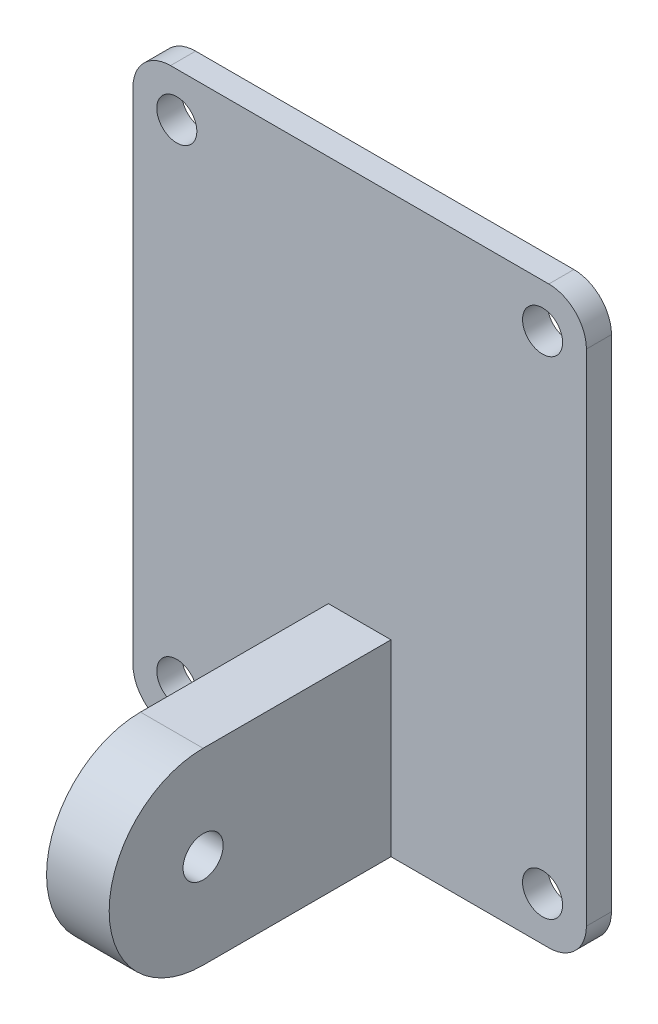
ISO-10303-21;
HEADER;
FILE_DESCRIPTION(('STEP AP214'),'2;1');
FILE_NAME('part.step','',(''),(''),'','','');
FILE_SCHEMA(('AUTOMOTIVE_DESIGN { 1 0 10303 214 1 1 1 1 }'));
ENDSEC;
DATA;
#1=APPLICATION_CONTEXT('core data for automotive mechanical design processes');
#2=APPLICATION_PROTOCOL_DEFINITION('international standard','automotive_design',2000,#1);
#3=PRODUCT_CONTEXT('',#1,'mechanical');
#4=PRODUCT('Part','Part','',(#3));
#5=PRODUCT_RELATED_PRODUCT_CATEGORY('part','',(#4));
#6=PRODUCT_DEFINITION_FORMATION('','',#4);
#7=PRODUCT_DEFINITION_CONTEXT('part definition',#1,'design');
#8=PRODUCT_DEFINITION('design','',#6,#7);
#9=PRODUCT_DEFINITION_SHAPE('','',#8);
#10=(LENGTH_UNIT() NAMED_UNIT(*) SI_UNIT(.MILLI.,.METRE.));
#11=(NAMED_UNIT(*) PLANE_ANGLE_UNIT() SI_UNIT($,.RADIAN.));
#12=(NAMED_UNIT(*) SI_UNIT($,.STERADIAN.) SOLID_ANGLE_UNIT());
#13=UNCERTAINTY_MEASURE_WITH_UNIT(LENGTH_MEASURE(1.E-05),#10,'distance_accuracy_value','');
#14=(GEOMETRIC_REPRESENTATION_CONTEXT(3) GLOBAL_UNCERTAINTY_ASSIGNED_CONTEXT((#13)) GLOBAL_UNIT_ASSIGNED_CONTEXT((#10,
#11,#12)) REPRESENTATION_CONTEXT('',''));
#15=CARTESIAN_POINT('',(0.,0.,0.));
#16=DIRECTION('',(0.,0.,1.));
#17=DIRECTION('',(1.,0.,0.));
#18=AXIS2_PLACEMENT_3D('',#15,#16,#17);
#19=CARTESIAN_POINT('',(312.882416229794,321.041107056174,2.));
#20=DIRECTION('',(0.,0.,1.));
#21=DIRECTION('',(1.,0.,0.));
#22=AXIS2_PLACEMENT_3D('',#19,#20,#21);
#23=PLANE('',#22);
#24=DIRECTION('',(0.,1.,0.));
#25=VECTOR('',#24,1.);
#26=CARTESIAN_POINT('',(330.482416229794,278.141107056174,2.));
#27=LINE('',#26,#25);
#28=CARTESIAN_POINT('',(330.482416229794,278.141107056174,2.));
#29=VERTEX_POINT('',#28);
#30=CARTESIAN_POINT('',(330.482416229794,293.141107056174,2.));
#31=VERTEX_POINT('',#30);
#32=EDGE_CURVE('E156',#29,#31,#27,.T.);
#33=ORIENTED_EDGE('',*,*,#32,.F.);
#34=DIRECTION('',(1.,0.,0.));
#35=VECTOR('',#34,1.);
#36=CARTESIAN_POINT('',(312.882416229794,278.141107056174,2.));
#37=LINE('',#36,#35);
#38=CARTESIAN_POINT('',(343.082416229794,278.141107056174,2.));
#39=VERTEX_POINT('',#38);
#40=EDGE_CURVE('E198',#29,#39,#37,.T.);
#41=ORIENTED_EDGE('',*,*,#40,.T.);
#42=CARTESIAN_POINT('',(343.082416229794,281.141107056174,2.));
#43=DIRECTION('',(0.,0.,1.));
#44=DIRECTION('',(1.,0.,0.));
#45=AXIS2_PLACEMENT_3D('',#42,#43,#44);
#46=CIRCLE('',#45,3.);
#47=CARTESIAN_POINT('',(346.082416229794,281.141107056174,2.));
#48=VERTEX_POINT('',#47);
#49=EDGE_CURVE('E201',#39,#48,#46,.T.);
#50=ORIENTED_EDGE('',*,*,#49,.T.);
#51=DIRECTION('',(0.,1.,0.));
#52=VECTOR('',#51,1.);
#53=CARTESIAN_POINT('',(346.082416229794,321.041107056174,2.));
#54=LINE('',#53,#52);
#55=CARTESIAN_POINT('',(346.082416229794,321.041107056174,2.));
#56=VERTEX_POINT('',#55);
#57=EDGE_CURVE('E203',#48,#56,#54,.T.);
#58=ORIENTED_EDGE('',*,*,#57,.T.);
#59=CARTESIAN_POINT('',(343.082416229794,321.041107056174,2.));
#60=DIRECTION('',(0.,0.,1.));
#61=DIRECTION('',(1.,0.,0.));
#62=AXIS2_PLACEMENT_3D('',#59,#60,#61);
#63=CIRCLE('',#62,3.);
#64=CARTESIAN_POINT('',(343.082416229794,324.041107056174,2.));
#65=VERTEX_POINT('',#64);
#66=EDGE_CURVE('E205',#56,#65,#63,.T.);
#67=ORIENTED_EDGE('',*,*,#66,.T.);
#68=DIRECTION('',(-1.,0.,0.));
#69=VECTOR('',#68,1.);
#70=CARTESIAN_POINT('',(312.882416229794,324.041107056174,2.));
#71=LINE('',#70,#69);
#72=CARTESIAN_POINT('',(312.882416229794,324.041107056174,2.));
#73=VERTEX_POINT('',#72);
#74=EDGE_CURVE('E207',#65,#73,#71,.T.);
#75=ORIENTED_EDGE('',*,*,#74,.T.);
#76=CARTESIAN_POINT('',(312.882416229794,321.041107056174,2.));
#77=DIRECTION('',(0.,0.,1.));
#78=DIRECTION('',(1.,0.,0.));
#79=AXIS2_PLACEMENT_3D('',#76,#77,#78);
#80=CIRCLE('',#79,3.);
#81=CARTESIAN_POINT('',(309.882416229794,321.041107056174,2.));
#82=VERTEX_POINT('',#81);
#83=EDGE_CURVE('E190',#73,#82,#80,.T.);
#84=ORIENTED_EDGE('',*,*,#83,.T.);
#85=DIRECTION('',(0.,-1.,0.));
#86=VECTOR('',#85,1.);
#87=CARTESIAN_POINT('',(309.882416229794,321.041107056174,2.));
#88=LINE('',#87,#86);
#89=CARTESIAN_POINT('',(309.882416229794,281.141107056174,2.));
#90=VERTEX_POINT('',#89);
#91=EDGE_CURVE('E193',#82,#90,#88,.T.);
#92=ORIENTED_EDGE('',*,*,#91,.T.);
#93=CARTESIAN_POINT('',(312.882416229794,281.141107056174,2.));
#94=DIRECTION('',(0.,0.,1.));
#95=DIRECTION('',(1.,0.,0.));
#96=AXIS2_PLACEMENT_3D('',#93,#94,#95);
#97=CIRCLE('',#96,3.);
#98=CARTESIAN_POINT('',(312.882416229794,278.141107056174,2.));
#99=VERTEX_POINT('',#98);
#100=EDGE_CURVE('E196',#90,#99,#97,.T.);
#101=ORIENTED_EDGE('',*,*,#100,.T.);
#102=CARTESIAN_POINT('',(325.482416229794,278.141107056174,2.));
#103=VERTEX_POINT('',#102);
#104=EDGE_CURVE('E199',#99,#103,#37,.T.);
#105=ORIENTED_EDGE('',*,*,#104,.T.);
#106=DIRECTION('',(0.,-1.,0.));
#107=VECTOR('',#106,1.);
#108=CARTESIAN_POINT('',(325.482416229794,293.141107056174,2.));
#109=LINE('',#108,#107);
#110=CARTESIAN_POINT('',(325.482416229794,293.141107056174,2.));
#111=VERTEX_POINT('',#110);
#112=EDGE_CURVE('E55',#111,#103,#109,.T.);
#113=ORIENTED_EDGE('',*,*,#112,.F.);
#114=DIRECTION('',(-1.,0.,0.));
#115=VECTOR('',#114,1.);
#116=CARTESIAN_POINT('',(330.482416229794,293.141107056174,2.));
#117=LINE('',#116,#115);
#118=EDGE_CURVE('E50',#31,#111,#117,.T.);
#119=ORIENTED_EDGE('',*,*,#118,.F.);
#120=EDGE_LOOP('',(#33,#41,#50,#58,#67,#75,#84,#92,#101,#105,#113,#119));
#121=FACE_BOUND('',#120,.T.);
#122=CARTESIAN_POINT('',(342.582416229794,320.541107056174,2.));
#123=DIRECTION('',(0.,0.,1.));
#124=DIRECTION('',(1.,0.,0.));
#125=AXIS2_PLACEMENT_3D('',#122,#123,#124);
#126=CIRCLE('',#125,1.59999999999999);
#127=CARTESIAN_POINT('',(344.182416229794,320.541107056174,2.));
#128=VERTEX_POINT('',#127);
#129=EDGE_CURVE('E172',#128,#128,#126,.T.);
#130=ORIENTED_EDGE('',*,*,#129,.F.);
#131=EDGE_LOOP('',(#130));
#132=FACE_BOUND('',#131,.T.);
#133=CARTESIAN_POINT('',(313.382416229794,320.541107056174,2.));
#134=DIRECTION('',(0.,0.,1.));
#135=DIRECTION('',(1.,0.,0.));
#136=AXIS2_PLACEMENT_3D('',#133,#134,#135);
#137=CIRCLE('',#136,1.59999999999999);
#138=CARTESIAN_POINT('',(314.982416229794,320.541107056174,2.));
#139=VERTEX_POINT('',#138);
#140=EDGE_CURVE('E184',#139,#139,#137,.T.);
#141=ORIENTED_EDGE('',*,*,#140,.F.);
#142=EDGE_LOOP('',(#141));
#143=FACE_BOUND('',#142,.T.);
#144=CARTESIAN_POINT('',(313.382416229794,281.641107056174,2.));
#145=DIRECTION('',(0.,0.,1.));
#146=DIRECTION('',(1.,0.,0.));
#147=AXIS2_PLACEMENT_3D('',#144,#145,#146);
#148=CIRCLE('',#147,1.59999999999999);
#149=CARTESIAN_POINT('',(314.982416229794,281.641107056174,2.));
#150=VERTEX_POINT('',#149);
#151=EDGE_CURVE('E178',#150,#150,#148,.T.);
#152=ORIENTED_EDGE('',*,*,#151,.F.);
#153=EDGE_LOOP('',(#152));
#154=FACE_BOUND('',#153,.T.);
#155=CARTESIAN_POINT('',(342.582416229794,281.641107056174,2.));
#156=DIRECTION('',(0.,0.,1.));
#157=DIRECTION('',(1.,0.,0.));
#158=AXIS2_PLACEMENT_3D('',#155,#156,#157);
#159=CIRCLE('',#158,1.59999999999999);
#160=CARTESIAN_POINT('',(344.182416229794,281.641107056174,2.));
#161=VERTEX_POINT('',#160);
#162=EDGE_CURVE('E166',#161,#161,#159,.T.);
#163=ORIENTED_EDGE('',*,*,#162,.F.);
#164=EDGE_LOOP('',(#163));
#165=FACE_BOUND('',#164,.T.);
#166=ADVANCED_FACE('F35',(#121,#132,#143,#154,#165),#23,.T.);
#167=CARTESIAN_POINT('',(312.882416229794,321.041107056174,0.));
#168=DIRECTION('',(0.,0.,1.));
#169=DIRECTION('',(1.,0.,0.));
#170=AXIS2_PLACEMENT_3D('',#167,#168,#169);
#171=PLANE('',#170);
#172=CARTESIAN_POINT('',(312.882416229794,321.041107056174,0.));
#173=DIRECTION('',(0.,0.,1.));
#174=DIRECTION('',(1.,0.,0.));
#175=AXIS2_PLACEMENT_3D('',#172,#173,#174);
#176=CIRCLE('',#175,3.);
#177=CARTESIAN_POINT('',(312.882416229794,324.041107056174,0.));
#178=VERTEX_POINT('',#177);
#179=CARTESIAN_POINT('',(309.882416229794,321.041107056174,0.));
#180=VERTEX_POINT('',#179);
#181=EDGE_CURVE('E187',#178,#180,#176,.T.);
#182=ORIENTED_EDGE('',*,*,#181,.F.);
#183=DIRECTION('',(-1.,0.,0.));
#184=VECTOR('',#183,1.);
#185=CARTESIAN_POINT('',(312.882416229794,324.041107056174,0.));
#186=LINE('',#185,#184);
#187=CARTESIAN_POINT('',(343.082416229794,324.041107056174,0.));
#188=VERTEX_POINT('',#187);
#189=EDGE_CURVE('E194',#188,#178,#186,.T.);
#190=ORIENTED_EDGE('',*,*,#189,.F.);
#191=CARTESIAN_POINT('',(343.082416229794,321.041107056174,0.));
#192=DIRECTION('',(0.,0.,1.));
#193=DIRECTION('',(1.,0.,0.));
#194=AXIS2_PLACEMENT_3D('',#191,#192,#193);
#195=CIRCLE('',#194,3.);
#196=CARTESIAN_POINT('',(346.082416229794,321.041107056174,0.));
#197=VERTEX_POINT('',#196);
#198=EDGE_CURVE('E222',#197,#188,#195,.T.);
#199=ORIENTED_EDGE('',*,*,#198,.F.);
#200=DIRECTION('',(0.,1.,0.));
#201=VECTOR('',#200,1.);
#202=CARTESIAN_POINT('',(346.082416229794,321.041107056174,0.));
#203=LINE('',#202,#201);
#204=CARTESIAN_POINT('',(346.082416229794,281.141107056174,0.));
#205=VERTEX_POINT('',#204);
#206=EDGE_CURVE('E220',#205,#197,#203,.T.);
#207=ORIENTED_EDGE('',*,*,#206,.F.);
#208=CARTESIAN_POINT('',(343.082416229794,281.141107056174,0.));
#209=DIRECTION('',(0.,0.,1.));
#210=DIRECTION('',(1.,0.,0.));
#211=AXIS2_PLACEMENT_3D('',#208,#209,#210);
#212=CIRCLE('',#211,3.);
#213=CARTESIAN_POINT('',(343.082416229794,278.141107056174,0.));
#214=VERTEX_POINT('',#213);
#215=EDGE_CURVE('E218',#214,#205,#212,.T.);
#216=ORIENTED_EDGE('',*,*,#215,.F.);
#217=DIRECTION('',(1.,0.,0.));
#218=VECTOR('',#217,1.);
#219=CARTESIAN_POINT('',(312.882416229794,278.141107056174,0.));
#220=LINE('',#219,#218);
#221=CARTESIAN_POINT('',(312.882416229794,278.141107056174,0.));
#222=VERTEX_POINT('',#221);
#223=EDGE_CURVE('E216',#222,#214,#220,.T.);
#224=ORIENTED_EDGE('',*,*,#223,.F.);
#225=CARTESIAN_POINT('',(312.882416229794,281.141107056174,0.));
#226=DIRECTION('',(0.,0.,1.));
#227=DIRECTION('',(1.,0.,0.));
#228=AXIS2_PLACEMENT_3D('',#225,#226,#227);
#229=CIRCLE('',#228,3.);
#230=CARTESIAN_POINT('',(309.882416229794,281.141107056174,0.));
#231=VERTEX_POINT('',#230);
#232=EDGE_CURVE('E214',#231,#222,#229,.T.);
#233=ORIENTED_EDGE('',*,*,#232,.F.);
#234=DIRECTION('',(0.,-1.,0.));
#235=VECTOR('',#234,1.);
#236=CARTESIAN_POINT('',(309.882416229794,321.041107056174,0.));
#237=LINE('',#236,#235);
#238=EDGE_CURVE('E212',#180,#231,#237,.T.);
#239=ORIENTED_EDGE('',*,*,#238,.F.);
#240=EDGE_LOOP('',(#182,#190,#199,#207,#216,#224,#233,#239));
#241=FACE_BOUND('',#240,.T.);
#242=CARTESIAN_POINT('',(313.382416229794,320.541107056174,0.));
#243=DIRECTION('',(0.,0.,1.));
#244=DIRECTION('',(1.,0.,0.));
#245=AXIS2_PLACEMENT_3D('',#242,#243,#244);
#246=CIRCLE('',#245,1.59999999999999);
#247=CARTESIAN_POINT('',(314.982416229794,320.541107056174,0.));
#248=VERTEX_POINT('',#247);
#249=EDGE_CURVE('E181',#248,#248,#246,.T.);
#250=ORIENTED_EDGE('',*,*,#249,.T.);
#251=EDGE_LOOP('',(#250));
#252=FACE_BOUND('',#251,.T.);
#253=CARTESIAN_POINT('',(313.382416229794,281.641107056174,0.));
#254=DIRECTION('',(0.,0.,1.));
#255=DIRECTION('',(1.,0.,0.));
#256=AXIS2_PLACEMENT_3D('',#253,#254,#255);
#257=CIRCLE('',#256,1.59999999999999);
#258=CARTESIAN_POINT('',(314.982416229794,281.641107056174,0.));
#259=VERTEX_POINT('',#258);
#260=EDGE_CURVE('E175',#259,#259,#257,.T.);
#261=ORIENTED_EDGE('',*,*,#260,.T.);
#262=EDGE_LOOP('',(#261));
#263=FACE_BOUND('',#262,.T.);
#264=CARTESIAN_POINT('',(342.582416229794,320.541107056174,0.));
#265=DIRECTION('',(0.,0.,1.));
#266=DIRECTION('',(1.,0.,0.));
#267=AXIS2_PLACEMENT_3D('',#264,#265,#266);
#268=CIRCLE('',#267,1.59999999999999);
#269=CARTESIAN_POINT('',(344.182416229794,320.541107056174,0.));
#270=VERTEX_POINT('',#269);
#271=EDGE_CURVE('E169',#270,#270,#268,.T.);
#272=ORIENTED_EDGE('',*,*,#271,.T.);
#273=EDGE_LOOP('',(#272));
#274=FACE_BOUND('',#273,.T.);
#275=CARTESIAN_POINT('',(342.582416229794,281.641107056174,0.));
#276=DIRECTION('',(0.,0.,1.));
#277=DIRECTION('',(1.,0.,0.));
#278=AXIS2_PLACEMENT_3D('',#275,#276,#277);
#279=CIRCLE('',#278,1.59999999999999);
#280=CARTESIAN_POINT('',(344.182416229794,281.641107056174,0.));
#281=VERTEX_POINT('',#280);
#282=EDGE_CURVE('E165',#281,#281,#279,.T.);
#283=ORIENTED_EDGE('',*,*,#282,.T.);
#284=EDGE_LOOP('',(#283));
#285=FACE_BOUND('',#284,.T.);
#286=ADVANCED_FACE('F252',(#241,#252,#263,#274,#285),#171,.F.);
#287=CARTESIAN_POINT('',(312.882416229794,321.041107056174,2.));
#288=DIRECTION('',(0.,0.,-1.));
#289=DIRECTION('',(-1.,0.,0.));
#290=AXIS2_PLACEMENT_3D('',#287,#288,#289);
#291=CYLINDRICAL_SURFACE('',#290,3.);
#292=ORIENTED_EDGE('',*,*,#181,.T.);
#293=DIRECTION('',(0.,0.,-1.));
#294=VECTOR('',#293,1.);
#295=CARTESIAN_POINT('',(309.882416229794,321.041107056174,2.));
#296=LINE('',#295,#294);
#297=EDGE_CURVE('E11',#82,#180,#296,.T.);
#298=ORIENTED_EDGE('',*,*,#297,.F.);
#299=ORIENTED_EDGE('',*,*,#83,.F.);
#300=DIRECTION('',(0.,0.,-1.));
#301=VECTOR('',#300,1.);
#302=CARTESIAN_POINT('',(312.882416229794,324.041107056174,2.));
#303=LINE('',#302,#301);
#304=EDGE_CURVE('E209',#73,#178,#303,.T.);
#305=ORIENTED_EDGE('',*,*,#304,.T.);
#306=EDGE_LOOP('',(#292,#298,#299,#305));
#307=FACE_BOUND('',#306,.T.);
#308=ADVANCED_FACE('F37',(#307),#291,.T.);
#309=CARTESIAN_POINT('',(309.882416229794,321.041107056174,2.));
#310=DIRECTION('',(1.,0.,0.));
#311=DIRECTION('',(0.,1.,0.));
#312=AXIS2_PLACEMENT_3D('',#309,#310,#311);
#313=PLANE('',#312);
#314=ORIENTED_EDGE('',*,*,#238,.T.);
#315=DIRECTION('',(0.,0.,-1.));
#316=VECTOR('',#315,1.);
#317=CARTESIAN_POINT('',(309.882416229794,281.141107056174,2.));
#318=LINE('',#317,#316);
#319=EDGE_CURVE('E43',#90,#231,#318,.T.);
#320=ORIENTED_EDGE('',*,*,#319,.F.);
#321=ORIENTED_EDGE('',*,*,#91,.F.);
#322=ORIENTED_EDGE('',*,*,#297,.T.);
#323=EDGE_LOOP('',(#314,#320,#321,#322));
#324=FACE_BOUND('',#323,.T.);
#325=ADVANCED_FACE('F307',(#324),#313,.F.);
#326=CARTESIAN_POINT('',(312.882416229794,281.141107056174,2.));
#327=DIRECTION('',(0.,0.,-1.));
#328=DIRECTION('',(-1.,0.,0.));
#329=AXIS2_PLACEMENT_3D('',#326,#327,#328);
#330=CYLINDRICAL_SURFACE('',#329,3.);
#331=ORIENTED_EDGE('',*,*,#232,.T.);
#332=DIRECTION('',(0.,0.,-1.));
#333=VECTOR('',#332,1.);
#334=CARTESIAN_POINT('',(312.882416229794,278.141107056174,2.));
#335=LINE('',#334,#333);
#336=EDGE_CURVE('E239',#99,#222,#335,.T.);
#337=ORIENTED_EDGE('',*,*,#336,.F.);
#338=ORIENTED_EDGE('',*,*,#100,.F.);
#339=ORIENTED_EDGE('',*,*,#319,.T.);
#340=EDGE_LOOP('',(#331,#337,#338,#339));
#341=FACE_BOUND('',#340,.T.);
#342=ADVANCED_FACE('F246',(#341),#330,.T.);
#343=CARTESIAN_POINT('',(312.882416229794,278.141107056174,2.));
#344=DIRECTION('',(0.,1.,0.));
#345=DIRECTION('',(-1.,0.,0.));
#346=AXIS2_PLACEMENT_3D('',#343,#344,#345);
#347=PLANE('',#346);
#348=ORIENTED_EDGE('',*,*,#223,.T.);
#349=DIRECTION('',(0.,0.,-1.));
#350=VECTOR('',#349,1.);
#351=CARTESIAN_POINT('',(343.082416229794,278.141107056174,2.));
#352=LINE('',#351,#350);
#353=EDGE_CURVE('E236',#39,#214,#352,.T.);
#354=ORIENTED_EDGE('',*,*,#353,.F.);
#355=ORIENTED_EDGE('',*,*,#40,.F.);
#356=DIRECTION('',(0.,0.,-1.));
#357=VECTOR('',#356,1.);
#358=CARTESIAN_POINT('',(330.482416229794,278.141107056174,17.));
#359=LINE('',#358,#357);
#360=CARTESIAN_POINT('',(330.482416229794,278.141107056174,17.));
#361=VERTEX_POINT('',#360);
#362=EDGE_CURVE('E130',#361,#29,#359,.T.);
#363=ORIENTED_EDGE('',*,*,#362,.F.);
#364=DIRECTION('',(1.,0.,0.));
#365=VECTOR('',#364,1.);
#366=CARTESIAN_POINT('',(325.482416229794,278.141107056174,17.));
#367=LINE('',#366,#365);
#368=CARTESIAN_POINT('',(325.482416229794,278.141107056174,17.));
#369=VERTEX_POINT('',#368);
#370=EDGE_CURVE('E123',#369,#361,#367,.T.);
#371=ORIENTED_EDGE('',*,*,#370,.F.);
#372=DIRECTION('',(0.,0.,-1.));
#373=VECTOR('',#372,1.);
#374=CARTESIAN_POINT('',(325.482416229794,278.141107056174,17.));
#375=LINE('',#374,#373);
#376=EDGE_CURVE('E127',#369,#103,#375,.T.);
#377=ORIENTED_EDGE('',*,*,#376,.T.);
#378=ORIENTED_EDGE('',*,*,#104,.F.);
#379=ORIENTED_EDGE('',*,*,#336,.T.);
#380=EDGE_LOOP('',(#348,#354,#355,#363,#371,#377,#378,#379));
#381=FACE_BOUND('',#380,.T.);
#382=ADVANCED_FACE('F125',(#381),#347,.F.);
#383=CARTESIAN_POINT('',(343.082416229794,281.141107056174,2.));
#384=DIRECTION('',(0.,0.,-1.));
#385=DIRECTION('',(-1.,0.,0.));
#386=AXIS2_PLACEMENT_3D('',#383,#384,#385);
#387=CYLINDRICAL_SURFACE('',#386,3.);
#388=ORIENTED_EDGE('',*,*,#215,.T.);
#389=DIRECTION('',(0.,0.,-1.));
#390=VECTOR('',#389,1.);
#391=CARTESIAN_POINT('',(346.082416229794,281.141107056174,2.));
#392=LINE('',#391,#390);
#393=EDGE_CURVE('E233',#48,#205,#392,.T.);
#394=ORIENTED_EDGE('',*,*,#393,.F.);
#395=ORIENTED_EDGE('',*,*,#49,.F.);
#396=ORIENTED_EDGE('',*,*,#353,.T.);
#397=EDGE_LOOP('',(#388,#394,#395,#396));
#398=FACE_BOUND('',#397,.T.);
#399=ADVANCED_FACE('F259',(#398),#387,.T.);
#400=CARTESIAN_POINT('',(346.082416229794,321.041107056174,2.));
#401=DIRECTION('',(-1.,0.,0.));
#402=DIRECTION('',(0.,-1.,0.));
#403=AXIS2_PLACEMENT_3D('',#400,#401,#402);
#404=PLANE('',#403);
#405=ORIENTED_EDGE('',*,*,#206,.T.);
#406=DIRECTION('',(0.,0.,-1.));
#407=VECTOR('',#406,1.);
#408=CARTESIAN_POINT('',(346.082416229794,321.041107056174,2.));
#409=LINE('',#408,#407);
#410=EDGE_CURVE('E230',#56,#197,#409,.T.);
#411=ORIENTED_EDGE('',*,*,#410,.F.);
#412=ORIENTED_EDGE('',*,*,#57,.F.);
#413=ORIENTED_EDGE('',*,*,#393,.T.);
#414=EDGE_LOOP('',(#405,#411,#412,#413));
#415=FACE_BOUND('',#414,.T.);
#416=ADVANCED_FACE('F297',(#415),#404,.F.);
#417=CARTESIAN_POINT('',(343.082416229794,321.041107056174,2.));
#418=DIRECTION('',(0.,0.,-1.));
#419=DIRECTION('',(-1.,0.,0.));
#420=AXIS2_PLACEMENT_3D('',#417,#418,#419);
#421=CYLINDRICAL_SURFACE('',#420,3.);
#422=ORIENTED_EDGE('',*,*,#198,.T.);
#423=DIRECTION('',(0.,0.,-1.));
#424=VECTOR('',#423,1.);
#425=CARTESIAN_POINT('',(343.082416229794,324.041107056174,2.));
#426=LINE('',#425,#424);
#427=EDGE_CURVE('E227',#65,#188,#426,.T.);
#428=ORIENTED_EDGE('',*,*,#427,.F.);
#429=ORIENTED_EDGE('',*,*,#66,.F.);
#430=ORIENTED_EDGE('',*,*,#410,.T.);
#431=EDGE_LOOP('',(#422,#428,#429,#430));
#432=FACE_BOUND('',#431,.T.);
#433=ADVANCED_FACE('F293',(#432),#421,.T.);
#434=CARTESIAN_POINT('',(312.882416229794,324.041107056174,2.));
#435=DIRECTION('',(0.,-1.,0.));
#436=DIRECTION('',(0.,0.,-1.));
#437=AXIS2_PLACEMENT_3D('',#434,#435,#436);
#438=PLANE('',#437);
#439=ORIENTED_EDGE('',*,*,#189,.T.);
#440=ORIENTED_EDGE('',*,*,#304,.F.);
#441=ORIENTED_EDGE('',*,*,#74,.F.);
#442=ORIENTED_EDGE('',*,*,#427,.T.);
#443=EDGE_LOOP('',(#439,#440,#441,#442));
#444=FACE_BOUND('',#443,.T.);
#445=ADVANCED_FACE('F290',(#444),#438,.F.);
#446=CARTESIAN_POINT('',(313.382416229794,320.541107056174,2.));
#447=DIRECTION('',(0.,0.,-1.));
#448=DIRECTION('',(-1.,0.,0.));
#449=AXIS2_PLACEMENT_3D('',#446,#447,#448);
#450=CYLINDRICAL_SURFACE('',#449,1.59999999999999);
#451=ORIENTED_EDGE('',*,*,#140,.T.);
#452=EDGE_LOOP('',(#451));
#453=FACE_BOUND('',#452,.T.);
#454=ORIENTED_EDGE('',*,*,#249,.F.);
#455=EDGE_LOOP('',(#454));
#456=FACE_BOUND('',#455,.T.);
#457=ADVANCED_FACE('F287',(#453,#456),#450,.F.);
#458=CARTESIAN_POINT('',(313.382416229794,281.641107056174,2.));
#459=DIRECTION('',(0.,0.,-1.));
#460=DIRECTION('',(-1.,0.,0.));
#461=AXIS2_PLACEMENT_3D('',#458,#459,#460);
#462=CYLINDRICAL_SURFACE('',#461,1.59999999999999);
#463=ORIENTED_EDGE('',*,*,#151,.T.);
#464=EDGE_LOOP('',(#463));
#465=FACE_BOUND('',#464,.T.);
#466=ORIENTED_EDGE('',*,*,#260,.F.);
#467=EDGE_LOOP('',(#466));
#468=FACE_BOUND('',#467,.T.);
#469=ADVANCED_FACE('F380',(#465,#468),#462,.F.);
#470=CARTESIAN_POINT('',(342.582416229794,320.541107056174,2.));
#471=DIRECTION('',(0.,0.,-1.));
#472=DIRECTION('',(-1.,0.,0.));
#473=AXIS2_PLACEMENT_3D('',#470,#471,#472);
#474=CYLINDRICAL_SURFACE('',#473,1.59999999999999);
#475=ORIENTED_EDGE('',*,*,#129,.T.);
#476=EDGE_LOOP('',(#475));
#477=FACE_BOUND('',#476,.T.);
#478=ORIENTED_EDGE('',*,*,#271,.F.);
#479=EDGE_LOOP('',(#478));
#480=FACE_BOUND('',#479,.T.);
#481=ADVANCED_FACE('F277',(#477,#480),#474,.F.);
#482=CARTESIAN_POINT('',(342.582416229794,281.641107056174,2.));
#483=DIRECTION('',(0.,0.,-1.));
#484=DIRECTION('',(-1.,0.,0.));
#485=AXIS2_PLACEMENT_3D('',#482,#483,#484);
#486=CYLINDRICAL_SURFACE('',#485,1.59999999999999);
#487=ORIENTED_EDGE('',*,*,#162,.T.);
#488=EDGE_LOOP('',(#487));
#489=FACE_BOUND('',#488,.T.);
#490=ORIENTED_EDGE('',*,*,#282,.F.);
#491=EDGE_LOOP('',(#490));
#492=FACE_BOUND('',#491,.T.);
#493=ADVANCED_FACE('F269',(#489,#492),#486,.F.);
#494=CARTESIAN_POINT('',(330.482416229794,293.141107056174,17.));
#495=DIRECTION('',(0.,-1.,0.));
#496=DIRECTION('',(0.,0.,-1.));
#497=AXIS2_PLACEMENT_3D('',#494,#495,#496);
#498=PLANE('',#497);
#499=ORIENTED_EDGE('',*,*,#118,.T.);
#500=DIRECTION('',(0.,0.,-1.));
#501=VECTOR('',#500,1.);
#502=CARTESIAN_POINT('',(325.482416229794,293.141107056174,17.));
#503=LINE('',#502,#501);
#504=CARTESIAN_POINT('',(325.482416229794,293.141107056174,17.));
#505=VERTEX_POINT('',#504);
#506=EDGE_CURVE('E142',#505,#111,#503,.T.);
#507=ORIENTED_EDGE('',*,*,#506,.F.);
#508=DIRECTION('',(-1.,0.,0.));
#509=VECTOR('',#508,1.);
#510=CARTESIAN_POINT('',(330.482416229794,293.141107056174,17.));
#511=LINE('',#510,#509);
#512=CARTESIAN_POINT('',(330.482416229794,293.141107056174,17.));
#513=VERTEX_POINT('',#512);
#514=EDGE_CURVE('E136',#513,#505,#511,.T.);
#515=ORIENTED_EDGE('',*,*,#514,.F.);
#516=DIRECTION('',(0.,0.,-1.));
#517=VECTOR('',#516,1.);
#518=CARTESIAN_POINT('',(330.482416229794,293.141107056174,17.));
#519=LINE('',#518,#517);
#520=EDGE_CURVE('E135',#513,#31,#519,.T.);
#521=ORIENTED_EDGE('',*,*,#520,.T.);
#522=EDGE_LOOP('',(#499,#507,#515,#521));
#523=FACE_BOUND('',#522,.T.);
#524=ADVANCED_FACE('F267',(#523),#498,.F.);
#525=CARTESIAN_POINT('',(325.482416229794,293.141107056174,17.));
#526=DIRECTION('',(1.,0.,0.));
#527=DIRECTION('',(0.,0.,-1.));
#528=AXIS2_PLACEMENT_3D('',#525,#526,#527);
#529=PLANE('',#528);
#530=CARTESIAN_POINT('',(325.482416229794,285.641107056174,17.));
#531=DIRECTION('',(-1.,0.,0.));
#532=DIRECTION('',(0.,0.,1.));
#533=AXIS2_PLACEMENT_3D('',#530,#531,#532);
#534=CIRCLE('',#533,1.59999999999999);
#535=CARTESIAN_POINT('',(325.482416229794,285.641107056174,18.6));
#536=VERTEX_POINT('',#535);
#537=EDGE_CURVE('E152',#536,#536,#534,.T.);
#538=ORIENTED_EDGE('',*,*,#537,.F.);
#539=EDGE_LOOP('',(#538));
#540=FACE_BOUND('',#539,.T.);
#541=ORIENTED_EDGE('',*,*,#112,.T.);
#542=ORIENTED_EDGE('',*,*,#376,.F.);
#543=CARTESIAN_POINT('',(325.482416229794,285.641107056174,17.));
#544=DIRECTION('',(-1.,0.,0.));
#545=DIRECTION('',(0.,0.,1.));
#546=AXIS2_PLACEMENT_3D('',#543,#544,#545);
#547=CIRCLE('',#546,7.50000000000001);
#548=EDGE_CURVE('E141',#369,#505,#547,.T.);
#549=ORIENTED_EDGE('',*,*,#548,.T.);
#550=ORIENTED_EDGE('',*,*,#506,.T.);
#551=EDGE_LOOP('',(#541,#542,#549,#550));
#552=FACE_BOUND('',#551,.T.);
#553=ADVANCED_FACE('F140',(#540,#552),#529,.F.);
#554=CARTESIAN_POINT('',(330.482416229794,278.141107056174,17.));
#555=DIRECTION('',(-1.,0.,0.));
#556=DIRECTION('',(0.,0.,1.));
#557=AXIS2_PLACEMENT_3D('',#554,#555,#556);
#558=PLANE('',#557);
#559=CARTESIAN_POINT('',(330.482416229794,285.641107056174,17.));
#560=DIRECTION('',(-1.,0.,0.));
#561=DIRECTION('',(0.,0.,1.));
#562=AXIS2_PLACEMENT_3D('',#559,#560,#561);
#563=CIRCLE('',#562,1.59999999999999);
#564=CARTESIAN_POINT('',(330.482416229794,285.641107056174,18.6));
#565=VERTEX_POINT('',#564);
#566=EDGE_CURVE('E148',#565,#565,#563,.T.);
#567=ORIENTED_EDGE('',*,*,#566,.T.);
#568=EDGE_LOOP('',(#567));
#569=FACE_BOUND('',#568,.T.);
#570=ORIENTED_EDGE('',*,*,#32,.T.);
#571=ORIENTED_EDGE('',*,*,#520,.F.);
#572=CARTESIAN_POINT('',(330.482416229794,285.641107056174,17.));
#573=DIRECTION('',(-1.,0.,0.));
#574=DIRECTION('',(0.,0.,1.));
#575=AXIS2_PLACEMENT_3D('',#572,#573,#574);
#576=CIRCLE('',#575,7.50000000000001);
#577=EDGE_CURVE('E147',#361,#513,#576,.T.);
#578=ORIENTED_EDGE('',*,*,#577,.F.);
#579=ORIENTED_EDGE('',*,*,#362,.T.);
#580=EDGE_LOOP('',(#570,#571,#578,#579));
#581=FACE_BOUND('',#580,.T.);
#582=ADVANCED_FACE('F265',(#569,#581),#558,.F.);
#583=CARTESIAN_POINT('',(330.482416229794,285.641107056174,17.));
#584=DIRECTION('',(-1.,0.,0.));
#585=DIRECTION('',(0.,0.,1.));
#586=AXIS2_PLACEMENT_3D('',#583,#584,#585);
#587=CYLINDRICAL_SURFACE('',#586,7.50000000000001);
#588=ORIENTED_EDGE('',*,*,#548,.F.);
#589=ORIENTED_EDGE('',*,*,#370,.T.);
#590=ORIENTED_EDGE('',*,*,#577,.T.);
#591=ORIENTED_EDGE('',*,*,#514,.T.);
#592=EDGE_LOOP('',(#588,#589,#590,#591));
#593=FACE_BOUND('',#592,.T.);
#594=ADVANCED_FACE('F145',(#593),#587,.T.);
#595=CARTESIAN_POINT('',(330.482416229794,285.641107056174,17.));
#596=DIRECTION('',(-1.,0.,0.));
#597=DIRECTION('',(0.,0.,1.));
#598=AXIS2_PLACEMENT_3D('',#595,#596,#597);
#599=CYLINDRICAL_SURFACE('',#598,1.59999999999999);
#600=ORIENTED_EDGE('',*,*,#566,.F.);
#601=EDGE_LOOP('',(#600));
#602=FACE_BOUND('',#601,.T.);
#603=ORIENTED_EDGE('',*,*,#537,.T.);
#604=EDGE_LOOP('',(#603));
#605=FACE_BOUND('',#604,.T.);
#606=ADVANCED_FACE('F414',(#602,#605),#599,.F.);
#607=CLOSED_SHELL('',(#166,#286,#308,#325,#342,#382,#399,#416,#433,#445,#457,#469,#481,#493,
#524,#553,#582,#594,#606));
#608=MANIFOLD_SOLID_BREP('B2',#607);
#609=ADVANCED_BREP_SHAPE_REPRESENTATION('',(#18,#608),#14);
#610=SHAPE_DEFINITION_REPRESENTATION(#9,#609);
ENDSEC;
END-ISO-10303-21;
